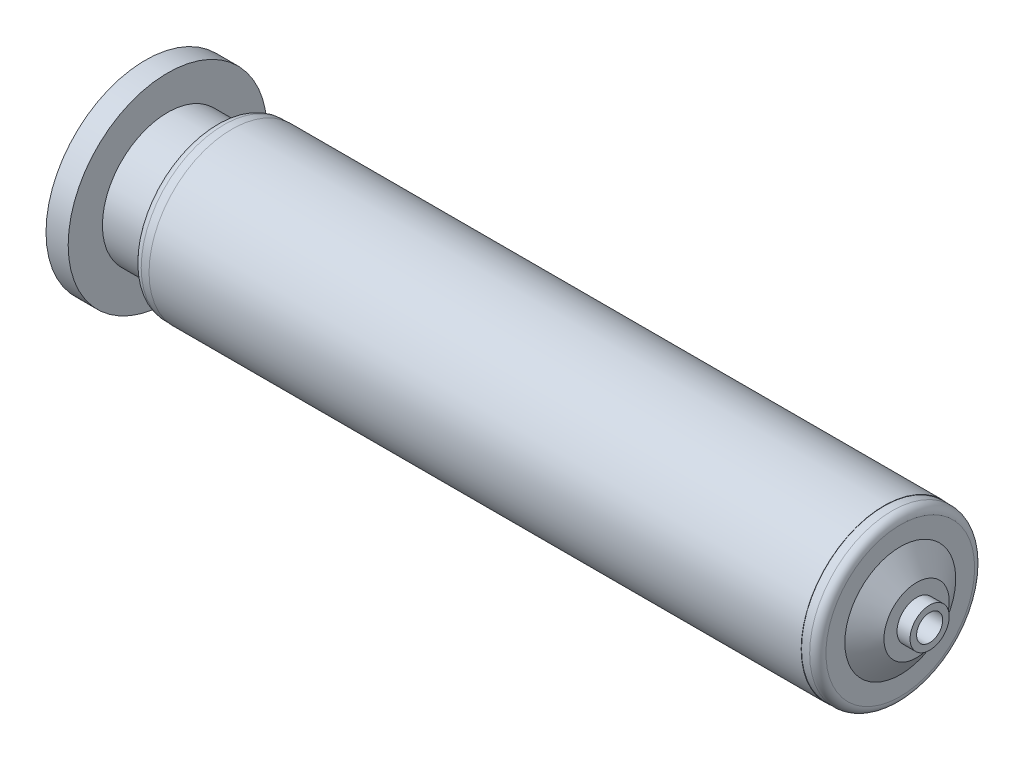
ISO-10303-21;
HEADER;
FILE_DESCRIPTION(('STEP AP214'),'2;1');
FILE_NAME('part.step','',(''),(''),'','','');
FILE_SCHEMA(('AUTOMOTIVE_DESIGN { 1 0 10303 214 1 1 1 1 }'));
ENDSEC;
DATA;
#1=APPLICATION_CONTEXT('core data for automotive mechanical design processes');
#2=APPLICATION_PROTOCOL_DEFINITION('international standard','automotive_design',2000,#1);
#3=PRODUCT_CONTEXT('',#1,'mechanical');
#4=PRODUCT('Part','Part','',(#3));
#5=PRODUCT_RELATED_PRODUCT_CATEGORY('part','',(#4));
#6=PRODUCT_DEFINITION_FORMATION('','',#4);
#7=PRODUCT_DEFINITION_CONTEXT('part definition',#1,'design');
#8=PRODUCT_DEFINITION('design','',#6,#7);
#9=PRODUCT_DEFINITION_SHAPE('','',#8);
#10=(LENGTH_UNIT() NAMED_UNIT(*) SI_UNIT(.MILLI.,.METRE.));
#11=(NAMED_UNIT(*) PLANE_ANGLE_UNIT() SI_UNIT($,.RADIAN.));
#12=(NAMED_UNIT(*) SI_UNIT($,.STERADIAN.) SOLID_ANGLE_UNIT());
#13=UNCERTAINTY_MEASURE_WITH_UNIT(LENGTH_MEASURE(1.E-05),#10,'distance_accuracy_value','');
#14=(GEOMETRIC_REPRESENTATION_CONTEXT(3) GLOBAL_UNCERTAINTY_ASSIGNED_CONTEXT((#13)) GLOBAL_UNIT_ASSIGNED_CONTEXT((#10,
#11,#12)) REPRESENTATION_CONTEXT('',''));
#15=CARTESIAN_POINT('',(0.,0.,0.));
#16=DIRECTION('',(0.,0.,1.));
#17=DIRECTION('',(1.,0.,0.));
#18=AXIS2_PLACEMENT_3D('',#15,#16,#17);
#19=CARTESIAN_POINT('',(-127.5,0.,6.));
#20=DIRECTION('',(-1.,0.,0.));
#21=DIRECTION('',(0.,0.,1.));
#22=AXIS2_PLACEMENT_3D('',#19,#20,#21);
#23=PLANE('',#22);
#24=CARTESIAN_POINT('',(-127.5,0.,0.));
#25=DIRECTION('',(1.,0.,0.));
#26=DIRECTION('',(0.,0.,-1.));
#27=AXIS2_PLACEMENT_3D('',#24,#25,#26);
#28=CIRCLE('',#27,4.);
#29=CARTESIAN_POINT('',(-127.5,0.,-4.));
#30=VERTEX_POINT('',#29);
#31=EDGE_CURVE('E107',#30,#30,#28,.T.);
#32=ORIENTED_EDGE('',*,*,#31,.T.);
#33=EDGE_LOOP('',(#32));
#34=FACE_BOUND('',#33,.T.);
#35=CARTESIAN_POINT('',(-127.5,0.,0.));
#36=DIRECTION('',(-1.,0.,0.));
#37=DIRECTION('',(0.,0.,1.));
#38=AXIS2_PLACEMENT_3D('',#35,#36,#37);
#39=CIRCLE('',#38,6.);
#40=CARTESIAN_POINT('',(-127.5,0.,6.));
#41=VERTEX_POINT('',#40);
#42=EDGE_CURVE('E104',#41,#41,#39,.T.);
#43=ORIENTED_EDGE('',*,*,#42,.T.);
#44=EDGE_LOOP('',(#43));
#45=FACE_BOUND('',#44,.T.);
#46=ADVANCED_FACE('F33',(#34,#45),#23,.T.);
#47=CARTESIAN_POINT('',(127.5,0.,0.));
#48=DIRECTION('',(1.,0.,0.));
#49=DIRECTION('',(0.,0.,-1.));
#50=AXIS2_PLACEMENT_3D('',#47,#48,#49);
#51=PLANE('',#50);
#52=CARTESIAN_POINT('',(127.5,0.,0.));
#53=DIRECTION('',(1.,0.,0.));
#54=DIRECTION('',(0.,0.,-1.));
#55=AXIS2_PLACEMENT_3D('',#52,#53,#54);
#56=CIRCLE('',#55,4.);
#57=CARTESIAN_POINT('',(127.5,0.,-4.));
#58=VERTEX_POINT('',#57);
#59=EDGE_CURVE('E110',#58,#58,#56,.T.);
#60=ORIENTED_EDGE('',*,*,#59,.F.);
#61=EDGE_LOOP('',(#60));
#62=FACE_BOUND('',#61,.T.);
#63=CARTESIAN_POINT('',(127.5,0.,0.));
#64=DIRECTION('',(-1.,0.,0.));
#65=DIRECTION('',(0.,0.,1.));
#66=AXIS2_PLACEMENT_3D('',#63,#64,#65);
#67=CIRCLE('',#66,6.00000000000005);
#68=CARTESIAN_POINT('',(127.5,0.,6.));
#69=VERTEX_POINT('',#68);
#70=EDGE_CURVE('E53',#69,#69,#67,.T.);
#71=ORIENTED_EDGE('',*,*,#70,.F.);
#72=EDGE_LOOP('',(#71));
#73=FACE_BOUND('',#72,.T.);
#74=ADVANCED_FACE('F116',(#62,#73),#51,.T.);
#75=CARTESIAN_POINT('',(-127.5,0.,0.));
#76=DIRECTION('',(-1.,0.,0.));
#77=DIRECTION('',(0.,0.,1.));
#78=AXIS2_PLACEMENT_3D('',#75,#76,#77);
#79=CYLINDRICAL_SURFACE('',#78,6.00000000000005);
#80=ORIENTED_EDGE('',*,*,#70,.T.);
#81=EDGE_LOOP('',(#80));
#82=FACE_BOUND('',#81,.T.);
#83=CARTESIAN_POINT('',(123.5,0.,0.));
#84=DIRECTION('',(-1.,0.,0.));
#85=DIRECTION('',(0.,0.,1.));
#86=AXIS2_PLACEMENT_3D('',#83,#84,#85);
#87=CIRCLE('',#86,6.00000000000005);
#88=CARTESIAN_POINT('',(123.5,0.,6.));
#89=VERTEX_POINT('',#88);
#90=EDGE_CURVE('E56',#89,#89,#87,.T.);
#91=ORIENTED_EDGE('',*,*,#90,.F.);
#92=EDGE_LOOP('',(#91));
#93=FACE_BOUND('',#92,.T.);
#94=ADVANCED_FACE('F119',(#82,#93),#79,.T.);
#95=CARTESIAN_POINT('',(123.5,0.,10.));
#96=DIRECTION('',(1.,0.,0.));
#97=DIRECTION('',(0.,0.,-1.));
#98=AXIS2_PLACEMENT_3D('',#95,#96,#97);
#99=PLANE('',#98);
#100=ORIENTED_EDGE('',*,*,#90,.T.);
#101=EDGE_LOOP('',(#100));
#102=FACE_BOUND('',#101,.T.);
#103=CARTESIAN_POINT('',(123.5,0.,0.));
#104=DIRECTION('',(-1.,0.,0.));
#105=DIRECTION('',(0.,0.,1.));
#106=AXIS2_PLACEMENT_3D('',#103,#104,#105);
#107=CIRCLE('',#106,10.);
#108=CARTESIAN_POINT('',(123.5,0.,10.));
#109=VERTEX_POINT('',#108);
#110=EDGE_CURVE('E59',#109,#109,#107,.T.);
#111=ORIENTED_EDGE('',*,*,#110,.F.);
#112=EDGE_LOOP('',(#111));
#113=FACE_BOUND('',#112,.T.);
#114=ADVANCED_FACE('F125',(#102,#113),#99,.T.);
#115=CARTESIAN_POINT('',(118.5,0.,0.));
#116=DIRECTION('',(-1.,0.,0.));
#117=DIRECTION('',(0.,0.,1.));
#118=AXIS2_PLACEMENT_3D('',#115,#116,#117);
#119=CONICAL_SURFACE('',#118,17.,0.950546840812075);
#120=ORIENTED_EDGE('',*,*,#110,.T.);
#121=EDGE_LOOP('',(#120));
#122=FACE_BOUND('',#121,.T.);
#123=CARTESIAN_POINT('',(118.5,0.,0.));
#124=DIRECTION('',(-1.,0.,0.));
#125=DIRECTION('',(0.,0.,1.));
#126=AXIS2_PLACEMENT_3D('',#123,#124,#125);
#127=CIRCLE('',#126,17.);
#128=CARTESIAN_POINT('',(118.5,0.,17.));
#129=VERTEX_POINT('',#128);
#130=EDGE_CURVE('E62',#129,#129,#127,.T.);
#131=ORIENTED_EDGE('',*,*,#130,.F.);
#132=EDGE_LOOP('',(#131));
#133=FACE_BOUND('',#132,.T.);
#134=ADVANCED_FACE('F131',(#122,#133),#119,.T.);
#135=CARTESIAN_POINT('',(118.5,0.,17.));
#136=DIRECTION('',(1.,0.,0.));
#137=DIRECTION('',(0.,0.,-1.));
#138=AXIS2_PLACEMENT_3D('',#135,#136,#137);
#139=PLANE('',#138);
#140=CARTESIAN_POINT('',(118.5,0.,0.));
#141=DIRECTION('',(1.,0.,0.));
#142=DIRECTION('',(0.,0.,-1.));
#143=AXIS2_PLACEMENT_3D('',#140,#141,#142);
#144=CIRCLE('',#143,22.8);
#145=CARTESIAN_POINT('',(118.5,0.,-22.8000000000001));
#146=VERTEX_POINT('',#145);
#147=EDGE_CURVE('E44',#146,#146,#144,.T.);
#148=ORIENTED_EDGE('',*,*,#147,.T.);
#149=EDGE_LOOP('',(#148));
#150=FACE_BOUND('',#149,.T.);
#151=ORIENTED_EDGE('',*,*,#130,.T.);
#152=EDGE_LOOP('',(#151));
#153=FACE_BOUND('',#152,.T.);
#154=ADVANCED_FACE('F137',(#150,#153),#139,.T.);
#155=CARTESIAN_POINT('',(-127.5,0.,0.));
#156=DIRECTION('',(-1.,0.,0.));
#157=DIRECTION('',(0.,0.,1.));
#158=AXIS2_PLACEMENT_3D('',#155,#156,#157);
#159=CYLINDRICAL_SURFACE('',#158,25.3);
#160=CARTESIAN_POINT('',(116.,0.,0.));
#161=DIRECTION('',(1.,0.,0.));
#162=DIRECTION('',(0.,0.,-1.));
#163=AXIS2_PLACEMENT_3D('',#160,#161,#162);
#164=CIRCLE('',#163,25.3);
#165=CARTESIAN_POINT('',(116.,0.,-25.3000000000001));
#166=VERTEX_POINT('',#165);
#167=EDGE_CURVE('E48',#166,#166,#164,.F.);
#168=ORIENTED_EDGE('',*,*,#167,.T.);
#169=EDGE_LOOP('',(#168));
#170=FACE_BOUND('',#169,.T.);
#171=CARTESIAN_POINT('',(113.5,0.,0.));
#172=DIRECTION('',(-1.,0.,0.));
#173=DIRECTION('',(0.,0.,1.));
#174=AXIS2_PLACEMENT_3D('',#171,#172,#173);
#175=CIRCLE('',#174,25.3);
#176=CARTESIAN_POINT('',(113.5,0.,25.3));
#177=VERTEX_POINT('',#176);
#178=EDGE_CURVE('E65',#177,#177,#175,.T.);
#179=ORIENTED_EDGE('',*,*,#178,.F.);
#180=EDGE_LOOP('',(#179));
#181=FACE_BOUND('',#180,.T.);
#182=ADVANCED_FACE('F142',(#170,#181),#159,.T.);
#183=CARTESIAN_POINT('',(113.5,0.,25.3));
#184=DIRECTION('',(1.,0.,0.));
#185=DIRECTION('',(0.,0.,-1.));
#186=AXIS2_PLACEMENT_3D('',#183,#184,#185);
#187=PLANE('',#186);
#188=ORIENTED_EDGE('',*,*,#178,.T.);
#189=EDGE_LOOP('',(#188));
#190=FACE_BOUND('',#189,.T.);
#191=CARTESIAN_POINT('',(113.5,0.,0.));
#192=DIRECTION('',(-1.,0.,0.));
#193=DIRECTION('',(0.,0.,1.));
#194=AXIS2_PLACEMENT_3D('',#191,#192,#193);
#195=CIRCLE('',#194,25.4);
#196=CARTESIAN_POINT('',(113.5,0.,25.4));
#197=VERTEX_POINT('',#196);
#198=EDGE_CURVE('E68',#197,#197,#195,.T.);
#199=ORIENTED_EDGE('',*,*,#198,.F.);
#200=EDGE_LOOP('',(#199));
#201=FACE_BOUND('',#200,.T.);
#202=ADVANCED_FACE('F149',(#190,#201),#187,.T.);
#203=CARTESIAN_POINT('',(-127.5,0.,0.));
#204=DIRECTION('',(-1.,0.,0.));
#205=DIRECTION('',(0.,0.,1.));
#206=AXIS2_PLACEMENT_3D('',#203,#204,#205);
#207=CYLINDRICAL_SURFACE('',#206,25.4);
#208=ORIENTED_EDGE('',*,*,#198,.T.);
#209=EDGE_LOOP('',(#208));
#210=FACE_BOUND('',#209,.T.);
#211=CARTESIAN_POINT('',(-86.5,0.,0.));
#212=DIRECTION('',(-1.,0.,0.));
#213=DIRECTION('',(0.,0.,1.));
#214=AXIS2_PLACEMENT_3D('',#211,#212,#213);
#215=CIRCLE('',#214,25.4);
#216=CARTESIAN_POINT('',(-86.5,0.,25.4));
#217=VERTEX_POINT('',#216);
#218=EDGE_CURVE('E71',#217,#217,#215,.T.);
#219=ORIENTED_EDGE('',*,*,#218,.F.);
#220=EDGE_LOOP('',(#219));
#221=FACE_BOUND('',#220,.T.);
#222=ADVANCED_FACE('F177',(#210,#221),#207,.T.);
#223=CARTESIAN_POINT('',(-86.5,0.,25.4));
#224=DIRECTION('',(-1.,0.,0.));
#225=DIRECTION('',(0.,0.,1.));
#226=AXIS2_PLACEMENT_3D('',#223,#224,#225);
#227=PLANE('',#226);
#228=ORIENTED_EDGE('',*,*,#218,.T.);
#229=EDGE_LOOP('',(#228));
#230=FACE_BOUND('',#229,.T.);
#231=CARTESIAN_POINT('',(-86.5,0.,0.));
#232=DIRECTION('',(-1.,0.,0.));
#233=DIRECTION('',(0.,0.,1.));
#234=AXIS2_PLACEMENT_3D('',#231,#232,#233);
#235=CIRCLE('',#234,25.3);
#236=CARTESIAN_POINT('',(-86.5,0.,25.3));
#237=VERTEX_POINT('',#236);
#238=EDGE_CURVE('E74',#237,#237,#235,.T.);
#239=ORIENTED_EDGE('',*,*,#238,.F.);
#240=EDGE_LOOP('',(#239));
#241=FACE_BOUND('',#240,.T.);
#242=ADVANCED_FACE('F183',(#230,#241),#227,.T.);
#243=CARTESIAN_POINT('',(-127.5,0.,0.));
#244=DIRECTION('',(-1.,0.,0.));
#245=DIRECTION('',(0.,0.,1.));
#246=AXIS2_PLACEMENT_3D('',#243,#244,#245);
#247=CYLINDRICAL_SURFACE('',#246,25.3);
#248=CARTESIAN_POINT('',(-89.,0.,0.));
#249=DIRECTION('',(-1.,0.,0.));
#250=DIRECTION('',(0.,0.,1.));
#251=AXIS2_PLACEMENT_3D('',#248,#249,#250);
#252=CIRCLE('',#251,25.3);
#253=CARTESIAN_POINT('',(-89.,0.,25.3));
#254=VERTEX_POINT('',#253);
#255=EDGE_CURVE('E10',#254,#254,#252,.F.);
#256=ORIENTED_EDGE('',*,*,#255,.T.);
#257=EDGE_LOOP('',(#256));
#258=FACE_BOUND('',#257,.T.);
#259=ORIENTED_EDGE('',*,*,#238,.T.);
#260=EDGE_LOOP('',(#259));
#261=FACE_BOUND('',#260,.T.);
#262=ADVANCED_FACE('F189',(#258,#261),#247,.T.);
#263=CARTESIAN_POINT('',(-91.5,0.,25.3));
#264=DIRECTION('',(-1.,0.,0.));
#265=DIRECTION('',(0.,0.,1.));
#266=AXIS2_PLACEMENT_3D('',#263,#264,#265);
#267=PLANE('',#266);
#268=CARTESIAN_POINT('',(-91.5,0.,0.));
#269=DIRECTION('',(-1.,0.,0.));
#270=DIRECTION('',(0.,0.,1.));
#271=AXIS2_PLACEMENT_3D('',#268,#269,#270);
#272=CIRCLE('',#271,22.8);
#273=CARTESIAN_POINT('',(-91.5,0.,22.8));
#274=VERTEX_POINT('',#273);
#275=EDGE_CURVE('E40',#274,#274,#272,.T.);
#276=ORIENTED_EDGE('',*,*,#275,.T.);
#277=EDGE_LOOP('',(#276));
#278=FACE_BOUND('',#277,.T.);
#279=CARTESIAN_POINT('',(-91.5,0.,0.));
#280=DIRECTION('',(-1.,0.,0.));
#281=DIRECTION('',(0.,0.,1.));
#282=AXIS2_PLACEMENT_3D('',#279,#280,#281);
#283=CIRCLE('',#282,20.);
#284=CARTESIAN_POINT('',(-91.5,0.,20.));
#285=VERTEX_POINT('',#284);
#286=EDGE_CURVE('E77',#285,#285,#283,.T.);
#287=ORIENTED_EDGE('',*,*,#286,.F.);
#288=EDGE_LOOP('',(#287));
#289=FACE_BOUND('',#288,.T.);
#290=ADVANCED_FACE('F193',(#278,#289),#267,.T.);
#291=CARTESIAN_POINT('',(-127.5,0.,0.));
#292=DIRECTION('',(-1.,0.,0.));
#293=DIRECTION('',(0.,0.,1.));
#294=AXIS2_PLACEMENT_3D('',#291,#292,#293);
#295=CYLINDRICAL_SURFACE('',#294,20.);
#296=ORIENTED_EDGE('',*,*,#286,.T.);
#297=EDGE_LOOP('',(#296));
#298=FACE_BOUND('',#297,.T.);
#299=CARTESIAN_POINT('',(-106.2,0.,0.));
#300=DIRECTION('',(-1.,0.,0.));
#301=DIRECTION('',(0.,0.,1.));
#302=AXIS2_PLACEMENT_3D('',#299,#300,#301);
#303=CIRCLE('',#302,20.);
#304=CARTESIAN_POINT('',(-106.2,0.,20.));
#305=VERTEX_POINT('',#304);
#306=EDGE_CURVE('E80',#305,#305,#303,.T.);
#307=ORIENTED_EDGE('',*,*,#306,.F.);
#308=EDGE_LOOP('',(#307));
#309=FACE_BOUND('',#308,.T.);
#310=ADVANCED_FACE('F199',(#298,#309),#295,.T.);
#311=CARTESIAN_POINT('',(-106.2,0.,20.));
#312=DIRECTION('',(1.,0.,0.));
#313=DIRECTION('',(0.,0.,-1.));
#314=AXIS2_PLACEMENT_3D('',#311,#312,#313);
#315=PLANE('',#314);
#316=ORIENTED_EDGE('',*,*,#306,.T.);
#317=EDGE_LOOP('',(#316));
#318=FACE_BOUND('',#317,.T.);
#319=CARTESIAN_POINT('',(-106.2,0.,0.));
#320=DIRECTION('',(-1.,0.,0.));
#321=DIRECTION('',(0.,0.,1.));
#322=AXIS2_PLACEMENT_3D('',#319,#320,#321);
#323=CIRCLE('',#322,30.5);
#324=CARTESIAN_POINT('',(-106.2,0.,30.5));
#325=VERTEX_POINT('',#324);
#326=EDGE_CURVE('E83',#325,#325,#323,.T.);
#327=ORIENTED_EDGE('',*,*,#326,.F.);
#328=EDGE_LOOP('',(#327));
#329=FACE_BOUND('',#328,.T.);
#330=ADVANCED_FACE('F204',(#318,#329),#315,.T.);
#331=CARTESIAN_POINT('',(-127.5,0.,0.));
#332=DIRECTION('',(-1.,0.,0.));
#333=DIRECTION('',(0.,0.,1.));
#334=AXIS2_PLACEMENT_3D('',#331,#332,#333);
#335=CYLINDRICAL_SURFACE('',#334,30.5);
#336=ORIENTED_EDGE('',*,*,#326,.T.);
#337=EDGE_LOOP('',(#336));
#338=FACE_BOUND('',#337,.T.);
#339=CARTESIAN_POINT('',(-113.,0.,0.));
#340=DIRECTION('',(-1.,0.,0.));
#341=DIRECTION('',(0.,0.,1.));
#342=AXIS2_PLACEMENT_3D('',#339,#340,#341);
#343=CIRCLE('',#342,30.5);
#344=CARTESIAN_POINT('',(-113.,0.,30.5));
#345=VERTEX_POINT('',#344);
#346=EDGE_CURVE('E86',#345,#345,#343,.T.);
#347=ORIENTED_EDGE('',*,*,#346,.F.);
#348=EDGE_LOOP('',(#347));
#349=FACE_BOUND('',#348,.T.);
#350=ADVANCED_FACE('F208',(#338,#349),#335,.T.);
#351=CARTESIAN_POINT('',(-113.,0.,30.5));
#352=DIRECTION('',(-1.,0.,0.));
#353=DIRECTION('',(0.,0.,1.));
#354=AXIS2_PLACEMENT_3D('',#351,#352,#353);
#355=PLANE('',#354);
#356=ORIENTED_EDGE('',*,*,#346,.T.);
#357=EDGE_LOOP('',(#356));
#358=FACE_BOUND('',#357,.T.);
#359=CARTESIAN_POINT('',(-113.,0.,0.));
#360=DIRECTION('',(-1.,0.,0.));
#361=DIRECTION('',(0.,0.,1.));
#362=AXIS2_PLACEMENT_3D('',#359,#360,#361);
#363=CIRCLE('',#362,18.75);
#364=CARTESIAN_POINT('',(-113.,0.,18.75));
#365=VERTEX_POINT('',#364);
#366=EDGE_CURVE('E89',#365,#365,#363,.T.);
#367=ORIENTED_EDGE('',*,*,#366,.F.);
#368=EDGE_LOOP('',(#367));
#369=FACE_BOUND('',#368,.T.);
#370=ADVANCED_FACE('F212',(#358,#369),#355,.T.);
#371=CARTESIAN_POINT('',(-127.5,0.,0.));
#372=DIRECTION('',(-1.,0.,0.));
#373=DIRECTION('',(0.,0.,1.));
#374=AXIS2_PLACEMENT_3D('',#371,#372,#373);
#375=CYLINDRICAL_SURFACE('',#374,18.75);
#376=ORIENTED_EDGE('',*,*,#366,.T.);
#377=EDGE_LOOP('',(#376));
#378=FACE_BOUND('',#377,.T.);
#379=CARTESIAN_POINT('',(-118.5,0.,0.));
#380=DIRECTION('',(-1.,0.,0.));
#381=DIRECTION('',(0.,0.,1.));
#382=AXIS2_PLACEMENT_3D('',#379,#380,#381);
#383=CIRCLE('',#382,18.75);
#384=CARTESIAN_POINT('',(-118.5,0.,18.75));
#385=VERTEX_POINT('',#384);
#386=EDGE_CURVE('E92',#385,#385,#383,.T.);
#387=ORIENTED_EDGE('',*,*,#386,.F.);
#388=EDGE_LOOP('',(#387));
#389=FACE_BOUND('',#388,.T.);
#390=ADVANCED_FACE('F216',(#378,#389),#375,.T.);
#391=CARTESIAN_POINT('',(-118.5,0.,17.));
#392=DIRECTION('',(-1.,0.,0.));
#393=DIRECTION('',(0.,0.,1.));
#394=AXIS2_PLACEMENT_3D('',#391,#392,#393);
#395=PLANE('',#394);
#396=ORIENTED_EDGE('',*,*,#386,.T.);
#397=EDGE_LOOP('',(#396));
#398=FACE_BOUND('',#397,.T.);
#399=CARTESIAN_POINT('',(-118.5,0.,0.));
#400=DIRECTION('',(-1.,0.,0.));
#401=DIRECTION('',(0.,0.,1.));
#402=AXIS2_PLACEMENT_3D('',#399,#400,#401);
#403=CIRCLE('',#402,17.);
#404=CARTESIAN_POINT('',(-118.5,0.,17.));
#405=VERTEX_POINT('',#404);
#406=EDGE_CURVE('E95',#405,#405,#403,.T.);
#407=ORIENTED_EDGE('',*,*,#406,.F.);
#408=EDGE_LOOP('',(#407));
#409=FACE_BOUND('',#408,.T.);
#410=ADVANCED_FACE('F220',(#398,#409),#395,.T.);
#411=CARTESIAN_POINT('',(-123.5,0.,0.));
#412=DIRECTION('',(1.,0.,0.));
#413=DIRECTION('',(0.,0.,-1.));
#414=AXIS2_PLACEMENT_3D('',#411,#412,#413);
#415=CONICAL_SURFACE('',#414,10.,0.950546840812073);
#416=ORIENTED_EDGE('',*,*,#406,.T.);
#417=EDGE_LOOP('',(#416));
#418=FACE_BOUND('',#417,.T.);
#419=CARTESIAN_POINT('',(-123.5,0.,0.));
#420=DIRECTION('',(-1.,0.,0.));
#421=DIRECTION('',(0.,0.,1.));
#422=AXIS2_PLACEMENT_3D('',#419,#420,#421);
#423=CIRCLE('',#422,10.);
#424=CARTESIAN_POINT('',(-123.5,0.,10.));
#425=VERTEX_POINT('',#424);
#426=EDGE_CURVE('E98',#425,#425,#423,.T.);
#427=ORIENTED_EDGE('',*,*,#426,.F.);
#428=EDGE_LOOP('',(#427));
#429=FACE_BOUND('',#428,.T.);
#430=ADVANCED_FACE('F224',(#418,#429),#415,.T.);
#431=CARTESIAN_POINT('',(-123.5,0.,6.00000000000005));
#432=DIRECTION('',(-1.,0.,0.));
#433=DIRECTION('',(0.,0.,1.));
#434=AXIS2_PLACEMENT_3D('',#431,#432,#433);
#435=PLANE('',#434);
#436=ORIENTED_EDGE('',*,*,#426,.T.);
#437=EDGE_LOOP('',(#436));
#438=FACE_BOUND('',#437,.T.);
#439=CARTESIAN_POINT('',(-123.5,0.,0.));
#440=DIRECTION('',(-1.,0.,0.));
#441=DIRECTION('',(0.,0.,1.));
#442=AXIS2_PLACEMENT_3D('',#439,#440,#441);
#443=CIRCLE('',#442,6.00000000000005);
#444=CARTESIAN_POINT('',(-123.5,0.,6.00000000000005));
#445=VERTEX_POINT('',#444);
#446=EDGE_CURVE('E101',#445,#445,#443,.T.);
#447=ORIENTED_EDGE('',*,*,#446,.F.);
#448=EDGE_LOOP('',(#447));
#449=FACE_BOUND('',#448,.T.);
#450=ADVANCED_FACE('F228',(#438,#449),#435,.T.);
#451=CARTESIAN_POINT('',(-127.5,0.,0.));
#452=DIRECTION('',(-1.,0.,0.));
#453=DIRECTION('',(0.,0.,1.));
#454=AXIS2_PLACEMENT_3D('',#451,#452,#453);
#455=CYLINDRICAL_SURFACE('',#454,6.00000000000002);
#456=ORIENTED_EDGE('',*,*,#446,.T.);
#457=EDGE_LOOP('',(#456));
#458=FACE_BOUND('',#457,.T.);
#459=ORIENTED_EDGE('',*,*,#42,.F.);
#460=EDGE_LOOP('',(#459));
#461=FACE_BOUND('',#460,.T.);
#462=ADVANCED_FACE('F166',(#458,#461),#455,.T.);
#463=CARTESIAN_POINT('',(-127.5,0.,0.));
#464=DIRECTION('',(1.,0.,0.));
#465=DIRECTION('',(0.,0.,-1.));
#466=AXIS2_PLACEMENT_3D('',#463,#464,#465);
#467=CYLINDRICAL_SURFACE('',#466,4.);
#468=ORIENTED_EDGE('',*,*,#31,.F.);
#469=EDGE_LOOP('',(#468));
#470=FACE_BOUND('',#469,.T.);
#471=ORIENTED_EDGE('',*,*,#59,.T.);
#472=EDGE_LOOP('',(#471));
#473=FACE_BOUND('',#472,.T.);
#474=ADVANCED_FACE('F114',(#470,#473),#467,.F.);
#475=CARTESIAN_POINT('',(116.,0.,0.));
#476=DIRECTION('',(1.,0.,0.));
#477=DIRECTION('',(0.,0.,-1.));
#478=AXIS2_PLACEMENT_3D('',#475,#476,#477);
#479=TOROIDAL_SURFACE('',#478,22.8,2.5);
#480=ORIENTED_EDGE('',*,*,#147,.F.);
#481=EDGE_LOOP('',(#480));
#482=FACE_BOUND('',#481,.T.);
#483=ORIENTED_EDGE('',*,*,#167,.F.);
#484=EDGE_LOOP('',(#483));
#485=FACE_BOUND('',#484,.T.);
#486=ADVANCED_FACE('F158',(#482,#485),#479,.T.);
#487=CARTESIAN_POINT('',(-89.,0.,0.));
#488=DIRECTION('',(-1.,0.,0.));
#489=DIRECTION('',(0.,0.,1.));
#490=AXIS2_PLACEMENT_3D('',#487,#488,#489);
#491=TOROIDAL_SURFACE('',#490,22.8,2.5);
#492=ORIENTED_EDGE('',*,*,#255,.F.);
#493=EDGE_LOOP('',(#492));
#494=FACE_BOUND('',#493,.T.);
#495=ORIENTED_EDGE('',*,*,#275,.F.);
#496=EDGE_LOOP('',(#495));
#497=FACE_BOUND('',#496,.T.);
#498=ADVANCED_FACE('F35',(#494,#497),#491,.T.);
#499=CLOSED_SHELL('',(#46,#74,#94,#114,#134,#154,#182,#202,#222,#242,#262,#290,#310,#330,#350,
#370,#390,#410,#430,#450,#462,#474,#486,#498));
#500=MANIFOLD_SOLID_BREP('B2',#499);
#501=ADVANCED_BREP_SHAPE_REPRESENTATION('',(#18,#500),#14);
#502=SHAPE_DEFINITION_REPRESENTATION(#9,#501);
ENDSEC;
END-ISO-10303-21;
